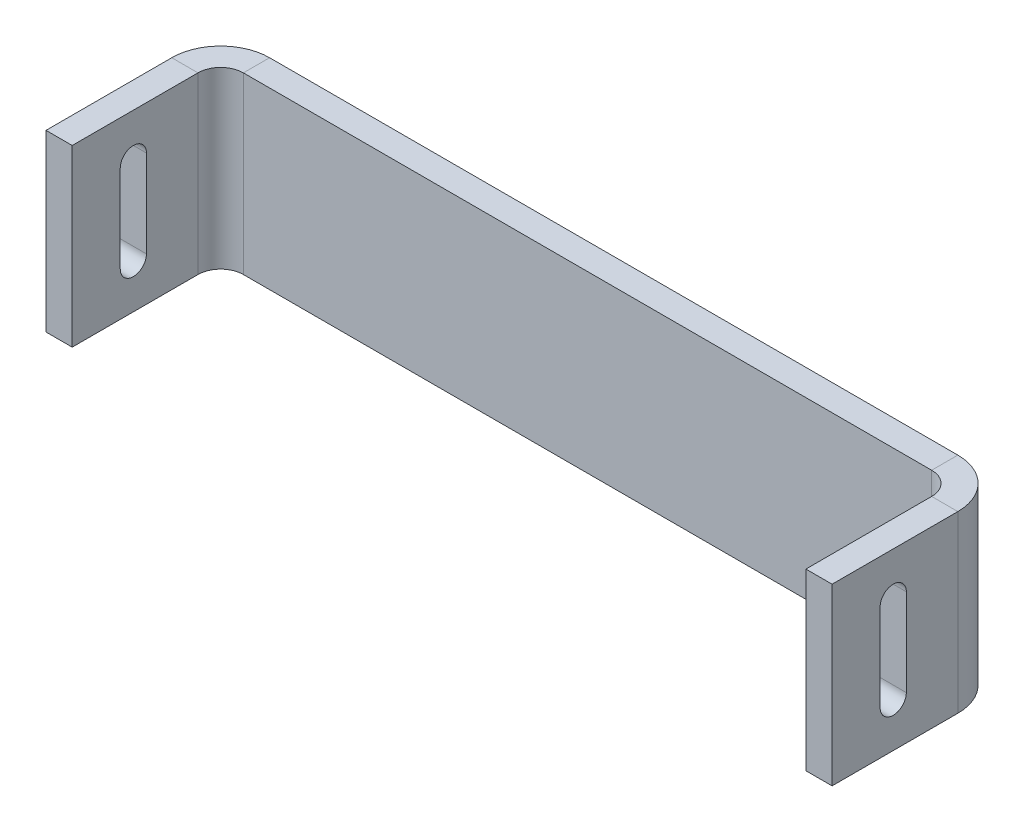
ISO-10303-21;
HEADER;
FILE_DESCRIPTION(('STEP AP214'),'2;1');
FILE_NAME('part.step','',(''),(''),'','','');
FILE_SCHEMA(('AUTOMOTIVE_DESIGN { 1 0 10303 214 1 1 1 1 }'));
ENDSEC;
DATA;
#1=APPLICATION_CONTEXT('core data for automotive mechanical design processes');
#2=APPLICATION_PROTOCOL_DEFINITION('international standard','automotive_design',2000,#1);
#3=PRODUCT_CONTEXT('',#1,'mechanical');
#4=PRODUCT('Part','Part','',(#3));
#5=PRODUCT_RELATED_PRODUCT_CATEGORY('part','',(#4));
#6=PRODUCT_DEFINITION_FORMATION('','',#4);
#7=PRODUCT_DEFINITION_CONTEXT('part definition',#1,'design');
#8=PRODUCT_DEFINITION('design','',#6,#7);
#9=PRODUCT_DEFINITION_SHAPE('','',#8);
#10=(LENGTH_UNIT() NAMED_UNIT(*) SI_UNIT(.MILLI.,.METRE.));
#11=(NAMED_UNIT(*) PLANE_ANGLE_UNIT() SI_UNIT($,.RADIAN.));
#12=(NAMED_UNIT(*) SI_UNIT($,.STERADIAN.) SOLID_ANGLE_UNIT());
#13=UNCERTAINTY_MEASURE_WITH_UNIT(LENGTH_MEASURE(1.E-05),#10,'distance_accuracy_value','');
#14=(GEOMETRIC_REPRESENTATION_CONTEXT(3) GLOBAL_UNCERTAINTY_ASSIGNED_CONTEXT((#13)) GLOBAL_UNIT_ASSIGNED_CONTEXT((#10,
#11,#12)) REPRESENTATION_CONTEXT('',''));
#15=CARTESIAN_POINT('',(0.,0.,0.));
#16=DIRECTION('',(0.,0.,1.));
#17=DIRECTION('',(1.,0.,0.));
#18=AXIS2_PLACEMENT_3D('',#15,#16,#17);
#19=CARTESIAN_POINT('',(0.,0.,-3.));
#20=DIRECTION('',(0.,0.,-1.));
#21=DIRECTION('',(-1.,0.,0.));
#22=AXIS2_PLACEMENT_3D('',#19,#20,#21);
#23=PLANE('',#22);
#24=DIRECTION('',(1.,0.,0.));
#25=VECTOR('',#24,1.);
#26=CARTESIAN_POINT('',(45.,-9.99999999999999,-3.));
#27=LINE('',#26,#25);
#28=CARTESIAN_POINT('',(-39.4,-10.,-3.));
#29=VERTEX_POINT('',#28);
#30=CARTESIAN_POINT('',(39.4,-9.99999999999999,-3.));
#31=VERTEX_POINT('',#30);
#32=EDGE_CURVE('E376',#29,#31,#27,.T.);
#33=ORIENTED_EDGE('',*,*,#32,.F.);
#34=DIRECTION('',(0.,-1.,0.));
#35=VECTOR('',#34,1.);
#36=CARTESIAN_POINT('',(-39.4,-10.,-3.));
#37=LINE('',#36,#35);
#38=CARTESIAN_POINT('',(-39.4,10.,-3.));
#39=VERTEX_POINT('',#38);
#40=EDGE_CURVE('E300',#29,#39,#37,.F.);
#41=ORIENTED_EDGE('',*,*,#40,.T.);
#42=DIRECTION('',(-1.,0.,0.));
#43=VECTOR('',#42,1.);
#44=CARTESIAN_POINT('',(45.,10.,-3.));
#45=LINE('',#44,#43);
#46=CARTESIAN_POINT('',(39.4,10.,-3.));
#47=VERTEX_POINT('',#46);
#48=EDGE_CURVE('E379',#47,#39,#45,.T.);
#49=ORIENTED_EDGE('',*,*,#48,.F.);
#50=DIRECTION('',(0.,1.,0.));
#51=VECTOR('',#50,1.);
#52=CARTESIAN_POINT('',(39.4,10.,-3.));
#53=LINE('',#52,#51);
#54=EDGE_CURVE('E353',#47,#31,#53,.F.);
#55=ORIENTED_EDGE('',*,*,#54,.T.);
#56=EDGE_LOOP('',(#33,#41,#49,#55));
#57=FACE_BOUND('',#56,.T.);
#58=ADVANCED_FACE('F85',(#57),#23,.T.);
#59=CARTESIAN_POINT('',(0.,0.,0.));
#60=DIRECTION('',(0.,0.,-1.));
#61=DIRECTION('',(-1.,0.,0.));
#62=AXIS2_PLACEMENT_3D('',#59,#60,#61);
#63=PLANE('',#62);
#64=DIRECTION('',(0.,-1.,0.));
#65=VECTOR('',#64,1.);
#66=CARTESIAN_POINT('',(-39.4,-10.,0.));
#67=LINE('',#66,#65);
#68=CARTESIAN_POINT('',(-39.4,-10.,0.));
#69=VERTEX_POINT('',#68);
#70=CARTESIAN_POINT('',(-39.4,9.99999999999999,0.));
#71=VERTEX_POINT('',#70);
#72=EDGE_CURVE('E313',#69,#71,#67,.F.);
#73=ORIENTED_EDGE('',*,*,#72,.F.);
#74=DIRECTION('',(1.,0.,0.));
#75=VECTOR('',#74,1.);
#76=CARTESIAN_POINT('',(45.,-9.99999999999999,0.));
#77=LINE('',#76,#75);
#78=CARTESIAN_POINT('',(39.4,-9.99999999999999,0.));
#79=VERTEX_POINT('',#78);
#80=EDGE_CURVE('E373',#69,#79,#77,.T.);
#81=ORIENTED_EDGE('',*,*,#80,.T.);
#82=DIRECTION('',(0.,1.,0.));
#83=VECTOR('',#82,1.);
#84=CARTESIAN_POINT('',(39.4,10.,0.));
#85=LINE('',#84,#83);
#86=CARTESIAN_POINT('',(39.4,10.,0.));
#87=VERTEX_POINT('',#86);
#88=EDGE_CURVE('E366',#87,#79,#85,.F.);
#89=ORIENTED_EDGE('',*,*,#88,.F.);
#90=DIRECTION('',(-1.,0.,0.));
#91=VECTOR('',#90,1.);
#92=CARTESIAN_POINT('',(45.,10.,0.));
#93=LINE('',#92,#91);
#94=EDGE_CURVE('E380',#87,#71,#93,.T.);
#95=ORIENTED_EDGE('',*,*,#94,.T.);
#96=EDGE_LOOP('',(#73,#81,#89,#95));
#97=FACE_BOUND('',#96,.T.);
#98=ADVANCED_FACE('F422',(#97),#63,.F.);
#99=CARTESIAN_POINT('',(45.,-9.99999999999999,-3.));
#100=DIRECTION('',(0.,-1.,0.));
#101=DIRECTION('',(1.,0.,0.));
#102=AXIS2_PLACEMENT_3D('',#99,#100,#101);
#103=PLANE('',#102);
#104=ORIENTED_EDGE('',*,*,#80,.F.);
#105=DIRECTION('',(0.,0.,-1.));
#106=VECTOR('',#105,1.);
#107=CARTESIAN_POINT('',(-39.4,-10.,0.));
#108=LINE('',#107,#106);
#109=EDGE_CURVE('E307',#69,#29,#108,.T.);
#110=ORIENTED_EDGE('',*,*,#109,.T.);
#111=ORIENTED_EDGE('',*,*,#32,.T.);
#112=DIRECTION('',(0.,0.,-1.));
#113=VECTOR('',#112,1.);
#114=CARTESIAN_POINT('',(39.4,-9.99999999999999,0.));
#115=LINE('',#114,#113);
#116=EDGE_CURVE('E370',#79,#31,#115,.T.);
#117=ORIENTED_EDGE('',*,*,#116,.F.);
#118=EDGE_LOOP('',(#104,#110,#111,#117));
#119=FACE_BOUND('',#118,.T.);
#120=ADVANCED_FACE('F87',(#119),#103,.T.);
#121=CARTESIAN_POINT('',(45.,10.,-3.));
#122=DIRECTION('',(0.,1.,0.));
#123=DIRECTION('',(-1.,0.,0.));
#124=AXIS2_PLACEMENT_3D('',#121,#122,#123);
#125=PLANE('',#124);
#126=DIRECTION('',(0.,0.,-1.));
#127=VECTOR('',#126,1.);
#128=CARTESIAN_POINT('',(-39.4,9.99999999999999,0.));
#129=LINE('',#128,#127);
#130=EDGE_CURVE('E317',#71,#39,#129,.T.);
#131=ORIENTED_EDGE('',*,*,#130,.F.);
#132=ORIENTED_EDGE('',*,*,#94,.F.);
#133=DIRECTION('',(0.,0.,-1.));
#134=VECTOR('',#133,1.);
#135=CARTESIAN_POINT('',(39.4,10.,0.));
#136=LINE('',#135,#134);
#137=EDGE_CURVE('E360',#87,#47,#136,.T.);
#138=ORIENTED_EDGE('',*,*,#137,.T.);
#139=ORIENTED_EDGE('',*,*,#48,.T.);
#140=EDGE_LOOP('',(#131,#132,#138,#139));
#141=FACE_BOUND('',#140,.T.);
#142=ADVANCED_FACE('F434',(#141),#125,.T.);
#143=CARTESIAN_POINT('',(39.4,-9.99999999999999,2.6));
#144=DIRECTION('',(0.,-1.,0.));
#145=DIRECTION('',(0.,0.,-1.));
#146=AXIS2_PLACEMENT_3D('',#143,#144,#145);
#147=PLANE('',#146);
#148=DIRECTION('',(-1.,0.,0.));
#149=VECTOR('',#148,1.);
#150=CARTESIAN_POINT('',(45.,-9.99999999999999,2.59999999999998));
#151=LINE('',#150,#149);
#152=CARTESIAN_POINT('',(42.,-9.99999999999999,2.59999999999999));
#153=VERTEX_POINT('',#152);
#154=CARTESIAN_POINT('',(45.,-9.99999999999999,2.59999999999998));
#155=VERTEX_POINT('',#154);
#156=EDGE_CURVE('E320',#153,#155,#151,.F.);
#157=ORIENTED_EDGE('',*,*,#156,.F.);
#158=CARTESIAN_POINT('',(39.4,-9.99999999999999,2.6));
#159=DIRECTION('',(0.,1.,0.));
#160=DIRECTION('',(0.,0.,1.));
#161=AXIS2_PLACEMENT_3D('',#158,#159,#160);
#162=CIRCLE('',#161,2.6);
#163=EDGE_CURVE('E363',#79,#153,#162,.F.);
#164=ORIENTED_EDGE('',*,*,#163,.F.);
#165=ORIENTED_EDGE('',*,*,#116,.T.);
#166=CARTESIAN_POINT('',(39.4,-9.99999999999999,2.6));
#167=DIRECTION('',(0.,1.,0.));
#168=DIRECTION('',(0.,0.,1.));
#169=AXIS2_PLACEMENT_3D('',#166,#167,#168);
#170=CIRCLE('',#169,5.6);
#171=EDGE_CURVE('E356',#31,#155,#170,.F.);
#172=ORIENTED_EDGE('',*,*,#171,.T.);
#173=EDGE_LOOP('',(#157,#164,#165,#172));
#174=FACE_BOUND('',#173,.T.);
#175=ADVANCED_FACE('F436',(#174),#147,.T.);
#176=CARTESIAN_POINT('',(39.4,10.,2.6));
#177=DIRECTION('',(0.,-1.,0.));
#178=DIRECTION('',(0.,0.,-1.));
#179=AXIS2_PLACEMENT_3D('',#176,#177,#178);
#180=PLANE('',#179);
#181=CARTESIAN_POINT('',(39.4,10.,2.6));
#182=DIRECTION('',(0.,1.,0.));
#183=DIRECTION('',(0.,0.,1.));
#184=AXIS2_PLACEMENT_3D('',#181,#182,#183);
#185=CIRCLE('',#184,2.6);
#186=CARTESIAN_POINT('',(42.,10.,2.59999999999999));
#187=VERTEX_POINT('',#186);
#188=EDGE_CURVE('E326',#187,#87,#185,.T.);
#189=ORIENTED_EDGE('',*,*,#188,.F.);
#190=DIRECTION('',(-1.,0.,0.));
#191=VECTOR('',#190,1.);
#192=CARTESIAN_POINT('',(42.,10.,2.59999999999999));
#193=LINE('',#192,#191);
#194=CARTESIAN_POINT('',(45.,10.,2.59999999999998));
#195=VERTEX_POINT('',#194);
#196=EDGE_CURVE('E346',#187,#195,#193,.F.);
#197=ORIENTED_EDGE('',*,*,#196,.T.);
#198=CARTESIAN_POINT('',(39.4,10.,2.6));
#199=DIRECTION('',(0.,1.,0.));
#200=DIRECTION('',(0.,0.,1.));
#201=AXIS2_PLACEMENT_3D('',#198,#199,#200);
#202=CIRCLE('',#201,5.6);
#203=EDGE_CURVE('E357',#195,#47,#202,.T.);
#204=ORIENTED_EDGE('',*,*,#203,.T.);
#205=ORIENTED_EDGE('',*,*,#137,.F.);
#206=EDGE_LOOP('',(#189,#197,#204,#205));
#207=FACE_BOUND('',#206,.T.);
#208=ADVANCED_FACE('F432',(#207),#180,.F.);
#209=CARTESIAN_POINT('',(39.4,10.,2.6));
#210=DIRECTION('',(0.,1.,0.));
#211=DIRECTION('',(1.,0.,0.));
#212=AXIS2_PLACEMENT_3D('',#209,#210,#211);
#213=CYLINDRICAL_SURFACE('',#212,5.6);
#214=ORIENTED_EDGE('',*,*,#54,.F.);
#215=ORIENTED_EDGE('',*,*,#203,.F.);
#216=DIRECTION('',(0.,1.,0.));
#217=VECTOR('',#216,1.);
#218=CARTESIAN_POINT('',(45.,-9.99999999999999,2.59999999999998));
#219=LINE('',#218,#217);
#220=EDGE_CURVE('E344',#195,#155,#219,.F.);
#221=ORIENTED_EDGE('',*,*,#220,.T.);
#222=ORIENTED_EDGE('',*,*,#171,.F.);
#223=EDGE_LOOP('',(#214,#215,#221,#222));
#224=FACE_BOUND('',#223,.T.);
#225=ADVANCED_FACE('F487',(#224),#213,.T.);
#226=CARTESIAN_POINT('',(39.4,10.,2.6));
#227=DIRECTION('',(0.,1.,0.));
#228=DIRECTION('',(1.,0.,0.));
#229=AXIS2_PLACEMENT_3D('',#226,#227,#228);
#230=CYLINDRICAL_SURFACE('',#229,2.6);
#231=ORIENTED_EDGE('',*,*,#88,.T.);
#232=ORIENTED_EDGE('',*,*,#163,.T.);
#233=DIRECTION('',(0.,1.,0.));
#234=VECTOR('',#233,1.);
#235=CARTESIAN_POINT('',(42.,-9.99999999999999,2.59999999999999));
#236=LINE('',#235,#234);
#237=EDGE_CURVE('E349',#153,#187,#236,.T.);
#238=ORIENTED_EDGE('',*,*,#237,.T.);
#239=ORIENTED_EDGE('',*,*,#188,.T.);
#240=EDGE_LOOP('',(#231,#232,#238,#239));
#241=FACE_BOUND('',#240,.T.);
#242=ADVANCED_FACE('F455',(#241),#230,.F.);
#243=CARTESIAN_POINT('',(45.,-9.99999999999999,0.));
#244=DIRECTION('',(0.,1.,0.));
#245=DIRECTION('',(0.,0.,1.));
#246=AXIS2_PLACEMENT_3D('',#243,#244,#245);
#247=PLANE('',#246);
#248=ORIENTED_EDGE('',*,*,#156,.T.);
#249=DIRECTION('',(0.,0.,-1.));
#250=VECTOR('',#249,1.);
#251=CARTESIAN_POINT('',(45.,-9.99999999999999,-1.75783387021378E-13));
#252=LINE('',#251,#250);
#253=CARTESIAN_POINT('',(45.0000000000001,-9.99999999999999,17.));
#254=VERTEX_POINT('',#253);
#255=EDGE_CURVE('E334',#254,#155,#252,.T.);
#256=ORIENTED_EDGE('',*,*,#255,.F.);
#257=DIRECTION('',(-1.,0.,0.));
#258=VECTOR('',#257,1.);
#259=CARTESIAN_POINT('',(45.0000000000001,-9.99999999999999,17.));
#260=LINE('',#259,#258);
#261=CARTESIAN_POINT('',(42.0000000000001,-9.99999999999999,17.));
#262=VERTEX_POINT('',#261);
#263=EDGE_CURVE('E327',#254,#262,#260,.T.);
#264=ORIENTED_EDGE('',*,*,#263,.T.);
#265=DIRECTION('',(0.,0.,1.));
#266=VECTOR('',#265,1.);
#267=CARTESIAN_POINT('',(42.,-9.99999999999999,0.));
#268=LINE('',#267,#266);
#269=EDGE_CURVE('E341',#262,#153,#268,.F.);
#270=ORIENTED_EDGE('',*,*,#269,.T.);
#271=EDGE_LOOP('',(#248,#256,#264,#270));
#272=FACE_BOUND('',#271,.T.);
#273=ADVANCED_FACE('F460',(#272),#247,.F.);
#274=CARTESIAN_POINT('',(45.0000000000001,10.,17.));
#275=DIRECTION('',(0.,-1.,0.));
#276=DIRECTION('',(0.,0.,-1.));
#277=AXIS2_PLACEMENT_3D('',#274,#275,#276);
#278=PLANE('',#277);
#279=ORIENTED_EDGE('',*,*,#196,.F.);
#280=DIRECTION('',(0.,0.,-1.));
#281=VECTOR('',#280,1.);
#282=CARTESIAN_POINT('',(42.0000000000001,10.,17.));
#283=LINE('',#282,#281);
#284=CARTESIAN_POINT('',(42.0000000000001,10.,17.));
#285=VERTEX_POINT('',#284);
#286=EDGE_CURVE('E339',#187,#285,#283,.F.);
#287=ORIENTED_EDGE('',*,*,#286,.T.);
#288=DIRECTION('',(-1.,0.,0.));
#289=VECTOR('',#288,1.);
#290=CARTESIAN_POINT('',(45.0000000000001,10.,17.));
#291=LINE('',#290,#289);
#292=CARTESIAN_POINT('',(45.0000000000001,10.,17.));
#293=VERTEX_POINT('',#292);
#294=EDGE_CURVE('E323',#293,#285,#291,.T.);
#295=ORIENTED_EDGE('',*,*,#294,.F.);
#296=DIRECTION('',(0.,0.,1.));
#297=VECTOR('',#296,1.);
#298=CARTESIAN_POINT('',(45.,10.,-1.75783387021378E-13));
#299=LINE('',#298,#297);
#300=EDGE_CURVE('E332',#195,#293,#299,.T.);
#301=ORIENTED_EDGE('',*,*,#300,.F.);
#302=EDGE_LOOP('',(#279,#287,#295,#301));
#303=FACE_BOUND('',#302,.T.);
#304=ADVANCED_FACE('F474',(#303),#278,.F.);
#305=CARTESIAN_POINT('',(45.,0.,-1.75783387021378E-13));
#306=DIRECTION('',(-1.,0.,0.));
#307=DIRECTION('',(0.,0.,1.));
#308=AXIS2_PLACEMENT_3D('',#305,#306,#307);
#309=PLANE('',#308);
#310=DIRECTION('',(0.,-1.,0.));
#311=VECTOR('',#310,1.);
#312=CARTESIAN_POINT('',(45.,5.,11.4999999999998));
#313=LINE('',#312,#311);
#314=CARTESIAN_POINT('',(45.,5.,11.4999999999998));
#315=VERTEX_POINT('',#314);
#316=CARTESIAN_POINT('',(45.,-5.,11.4999999999998));
#317=VERTEX_POINT('',#316);
#318=EDGE_CURVE('E233',#315,#317,#313,.T.);
#319=ORIENTED_EDGE('',*,*,#318,.F.);
#320=CARTESIAN_POINT('',(45.,5.,9.99999999999984));
#321=DIRECTION('',(1.,0.,0.));
#322=DIRECTION('',(0.,0.,-1.));
#323=AXIS2_PLACEMENT_3D('',#320,#321,#322);
#324=CIRCLE('',#323,1.5);
#325=CARTESIAN_POINT('',(45.,5.,8.49999999999984));
#326=VERTEX_POINT('',#325);
#327=EDGE_CURVE('E100',#326,#315,#324,.T.);
#328=ORIENTED_EDGE('',*,*,#327,.F.);
#329=DIRECTION('',(0.,1.,0.));
#330=VECTOR('',#329,1.);
#331=CARTESIAN_POINT('',(45.,5.,8.49999999999984));
#332=LINE('',#331,#330);
#333=CARTESIAN_POINT('',(45.,-5.,8.49999999999984));
#334=VERTEX_POINT('',#333);
#335=EDGE_CURVE('E240',#334,#326,#332,.T.);
#336=ORIENTED_EDGE('',*,*,#335,.F.);
#337=CARTESIAN_POINT('',(45.,-5.,9.99999999999984));
#338=DIRECTION('',(1.,0.,0.));
#339=DIRECTION('',(0.,0.,-1.));
#340=AXIS2_PLACEMENT_3D('',#337,#338,#339);
#341=CIRCLE('',#340,1.5);
#342=EDGE_CURVE('E224',#317,#334,#341,.T.);
#343=ORIENTED_EDGE('',*,*,#342,.F.);
#344=EDGE_LOOP('',(#319,#328,#336,#343));
#345=FACE_BOUND('',#344,.T.);
#346=ORIENTED_EDGE('',*,*,#220,.F.);
#347=ORIENTED_EDGE('',*,*,#300,.T.);
#348=DIRECTION('',(0.,-1.,0.));
#349=VECTOR('',#348,1.);
#350=CARTESIAN_POINT('',(45.0000000000001,0.,17.));
#351=LINE('',#350,#349);
#352=EDGE_CURVE('E330',#293,#254,#351,.T.);
#353=ORIENTED_EDGE('',*,*,#352,.T.);
#354=ORIENTED_EDGE('',*,*,#255,.T.);
#355=EDGE_LOOP('',(#346,#347,#353,#354));
#356=FACE_BOUND('',#355,.T.);
#357=ADVANCED_FACE('F237',(#345,#356),#309,.F.);
#358=CARTESIAN_POINT('',(42.,0.,-1.65308943004849E-13));
#359=DIRECTION('',(-1.,0.,0.));
#360=DIRECTION('',(0.,0.,1.));
#361=AXIS2_PLACEMENT_3D('',#358,#359,#360);
#362=PLANE('',#361);
#363=CARTESIAN_POINT('',(42.,5.,9.99999999999985));
#364=DIRECTION('',(-1.,0.,0.));
#365=DIRECTION('',(0.,0.,1.));
#366=AXIS2_PLACEMENT_3D('',#363,#364,#365);
#367=CIRCLE('',#366,1.5);
#368=CARTESIAN_POINT('',(42.,5.,11.4999999999998));
#369=VERTEX_POINT('',#368);
#370=CARTESIAN_POINT('',(42.,5.,8.49999999999985));
#371=VERTEX_POINT('',#370);
#372=EDGE_CURVE('E13',#369,#371,#367,.T.);
#373=ORIENTED_EDGE('',*,*,#372,.F.);
#374=DIRECTION('',(0.,1.,0.));
#375=VECTOR('',#374,1.);
#376=CARTESIAN_POINT('',(42.,0.,11.4999999999998));
#377=LINE('',#376,#375);
#378=CARTESIAN_POINT('',(42.,-5.,11.4999999999998));
#379=VERTEX_POINT('',#378);
#380=EDGE_CURVE('E396',#379,#369,#377,.T.);
#381=ORIENTED_EDGE('',*,*,#380,.F.);
#382=CARTESIAN_POINT('',(42.,-5.,9.99999999999985));
#383=DIRECTION('',(-1.,0.,0.));
#384=DIRECTION('',(0.,0.,1.));
#385=AXIS2_PLACEMENT_3D('',#382,#383,#384);
#386=CIRCLE('',#385,1.5);
#387=CARTESIAN_POINT('',(42.,-5.,8.49999999999985));
#388=VERTEX_POINT('',#387);
#389=EDGE_CURVE('E227',#388,#379,#386,.T.);
#390=ORIENTED_EDGE('',*,*,#389,.F.);
#391=DIRECTION('',(0.,-1.,0.));
#392=VECTOR('',#391,1.);
#393=CARTESIAN_POINT('',(42.,0.,8.49999999999985));
#394=LINE('',#393,#392);
#395=EDGE_CURVE('E93',#371,#388,#394,.T.);
#396=ORIENTED_EDGE('',*,*,#395,.F.);
#397=EDGE_LOOP('',(#373,#381,#390,#396));
#398=FACE_BOUND('',#397,.T.);
#399=ORIENTED_EDGE('',*,*,#286,.F.);
#400=ORIENTED_EDGE('',*,*,#237,.F.);
#401=ORIENTED_EDGE('',*,*,#269,.F.);
#402=DIRECTION('',(0.,1.,0.));
#403=VECTOR('',#402,1.);
#404=CARTESIAN_POINT('',(42.0000000000001,-9.99999999999999,17.));
#405=LINE('',#404,#403);
#406=EDGE_CURVE('E337',#285,#262,#405,.F.);
#407=ORIENTED_EDGE('',*,*,#406,.F.);
#408=EDGE_LOOP('',(#399,#400,#401,#407));
#409=FACE_BOUND('',#408,.T.);
#410=ADVANCED_FACE('F404',(#398,#409),#362,.T.);
#411=CARTESIAN_POINT('',(45.0000000000001,-9.99999999999999,17.));
#412=DIRECTION('',(0.,0.,-1.));
#413=DIRECTION('',(-1.,0.,0.));
#414=AXIS2_PLACEMENT_3D('',#411,#412,#413);
#415=PLANE('',#414);
#416=ORIENTED_EDGE('',*,*,#406,.T.);
#417=ORIENTED_EDGE('',*,*,#263,.F.);
#418=ORIENTED_EDGE('',*,*,#352,.F.);
#419=ORIENTED_EDGE('',*,*,#294,.T.);
#420=EDGE_LOOP('',(#416,#417,#418,#419));
#421=FACE_BOUND('',#420,.T.);
#422=ADVANCED_FACE('F468',(#421),#415,.F.);
#423=CARTESIAN_POINT('',(-39.4,9.99999999999999,2.6));
#424=DIRECTION('',(0.,1.,0.));
#425=DIRECTION('',(0.,0.,1.));
#426=AXIS2_PLACEMENT_3D('',#423,#424,#425);
#427=PLANE('',#426);
#428=DIRECTION('',(1.,0.,0.));
#429=VECTOR('',#428,1.);
#430=CARTESIAN_POINT('',(-45.,9.99999999999999,2.59999999999998));
#431=LINE('',#430,#429);
#432=CARTESIAN_POINT('',(-42.,9.99999999999999,2.59999999999999));
#433=VERTEX_POINT('',#432);
#434=CARTESIAN_POINT('',(-45.,9.99999999999999,2.59999999999998));
#435=VERTEX_POINT('',#434);
#436=EDGE_CURVE('E263',#433,#435,#431,.F.);
#437=ORIENTED_EDGE('',*,*,#436,.F.);
#438=CARTESIAN_POINT('',(-39.4,9.99999999999999,2.6));
#439=DIRECTION('',(0.,-1.,0.));
#440=DIRECTION('',(0.,0.,-1.));
#441=AXIS2_PLACEMENT_3D('',#438,#439,#440);
#442=CIRCLE('',#441,2.6);
#443=EDGE_CURVE('E310',#71,#433,#442,.F.);
#444=ORIENTED_EDGE('',*,*,#443,.F.);
#445=ORIENTED_EDGE('',*,*,#130,.T.);
#446=CARTESIAN_POINT('',(-39.4,9.99999999999999,2.6));
#447=DIRECTION('',(0.,-1.,0.));
#448=DIRECTION('',(0.,0.,-1.));
#449=AXIS2_PLACEMENT_3D('',#446,#447,#448);
#450=CIRCLE('',#449,5.6);
#451=EDGE_CURVE('E303',#39,#435,#450,.F.);
#452=ORIENTED_EDGE('',*,*,#451,.T.);
#453=EDGE_LOOP('',(#437,#444,#445,#452));
#454=FACE_BOUND('',#453,.T.);
#455=ADVANCED_FACE('F531',(#454),#427,.T.);
#456=CARTESIAN_POINT('',(-39.4,-10.,2.6));
#457=DIRECTION('',(0.,1.,0.));
#458=DIRECTION('',(0.,0.,1.));
#459=AXIS2_PLACEMENT_3D('',#456,#457,#458);
#460=PLANE('',#459);
#461=CARTESIAN_POINT('',(-39.4,-10.,2.6));
#462=DIRECTION('',(0.,-1.,0.));
#463=DIRECTION('',(0.,0.,-1.));
#464=AXIS2_PLACEMENT_3D('',#461,#462,#463);
#465=CIRCLE('',#464,2.6);
#466=CARTESIAN_POINT('',(-42.,-10.,2.59999999999999));
#467=VERTEX_POINT('',#466);
#468=EDGE_CURVE('E273',#467,#69,#465,.T.);
#469=ORIENTED_EDGE('',*,*,#468,.F.);
#470=DIRECTION('',(1.,0.,0.));
#471=VECTOR('',#470,1.);
#472=CARTESIAN_POINT('',(-42.,-10.,2.59999999999999));
#473=LINE('',#472,#471);
#474=CARTESIAN_POINT('',(-45.,-10.,2.59999999999998));
#475=VERTEX_POINT('',#474);
#476=EDGE_CURVE('E293',#467,#475,#473,.F.);
#477=ORIENTED_EDGE('',*,*,#476,.T.);
#478=CARTESIAN_POINT('',(-39.4,-10.,2.6));
#479=DIRECTION('',(0.,-1.,0.));
#480=DIRECTION('',(0.,0.,-1.));
#481=AXIS2_PLACEMENT_3D('',#478,#479,#480);
#482=CIRCLE('',#481,5.6);
#483=EDGE_CURVE('E304',#475,#29,#482,.T.);
#484=ORIENTED_EDGE('',*,*,#483,.T.);
#485=ORIENTED_EDGE('',*,*,#109,.F.);
#486=EDGE_LOOP('',(#469,#477,#484,#485));
#487=FACE_BOUND('',#486,.T.);
#488=ADVANCED_FACE('F540',(#487),#460,.F.);
#489=CARTESIAN_POINT('',(-39.4,-10.,2.6));
#490=DIRECTION('',(0.,-1.,0.));
#491=DIRECTION('',(-1.,0.,0.));
#492=AXIS2_PLACEMENT_3D('',#489,#490,#491);
#493=CYLINDRICAL_SURFACE('',#492,5.6);
#494=ORIENTED_EDGE('',*,*,#40,.F.);
#495=ORIENTED_EDGE('',*,*,#483,.F.);
#496=DIRECTION('',(0.,-1.,0.));
#497=VECTOR('',#496,1.);
#498=CARTESIAN_POINT('',(-45.,9.99999999999999,2.59999999999998));
#499=LINE('',#498,#497);
#500=EDGE_CURVE('E291',#475,#435,#499,.F.);
#501=ORIENTED_EDGE('',*,*,#500,.T.);
#502=ORIENTED_EDGE('',*,*,#451,.F.);
#503=EDGE_LOOP('',(#494,#495,#501,#502));
#504=FACE_BOUND('',#503,.T.);
#505=ADVANCED_FACE('F550',(#504),#493,.T.);
#506=CARTESIAN_POINT('',(-39.4,-10.,2.6));
#507=DIRECTION('',(0.,-1.,0.));
#508=DIRECTION('',(-1.,0.,0.));
#509=AXIS2_PLACEMENT_3D('',#506,#507,#508);
#510=CYLINDRICAL_SURFACE('',#509,2.6);
#511=ORIENTED_EDGE('',*,*,#72,.T.);
#512=ORIENTED_EDGE('',*,*,#443,.T.);
#513=DIRECTION('',(0.,-1.,0.));
#514=VECTOR('',#513,1.);
#515=CARTESIAN_POINT('',(-42.,9.99999999999999,2.59999999999999));
#516=LINE('',#515,#514);
#517=EDGE_CURVE('E296',#433,#467,#516,.T.);
#518=ORIENTED_EDGE('',*,*,#517,.T.);
#519=ORIENTED_EDGE('',*,*,#468,.T.);
#520=EDGE_LOOP('',(#511,#512,#518,#519));
#521=FACE_BOUND('',#520,.T.);
#522=ADVANCED_FACE('F561',(#521),#510,.F.);
#523=CARTESIAN_POINT('',(-45.,9.99999999999999,0.));
#524=DIRECTION('',(0.,-1.,0.));
#525=DIRECTION('',(0.,0.,-1.));
#526=AXIS2_PLACEMENT_3D('',#523,#524,#525);
#527=PLANE('',#526);
#528=ORIENTED_EDGE('',*,*,#436,.T.);
#529=DIRECTION('',(0.,0.,-1.));
#530=VECTOR('',#529,1.);
#531=CARTESIAN_POINT('',(-45.,9.99999999999999,-1.75783387021378E-13));
#532=LINE('',#531,#530);
#533=CARTESIAN_POINT('',(-45.0000000000001,9.99999999999999,17.));
#534=VERTEX_POINT('',#533);
#535=EDGE_CURVE('E281',#534,#435,#532,.T.);
#536=ORIENTED_EDGE('',*,*,#535,.F.);
#537=DIRECTION('',(1.,0.,0.));
#538=VECTOR('',#537,1.);
#539=CARTESIAN_POINT('',(-45.0000000000001,9.99999999999999,17.));
#540=LINE('',#539,#538);
#541=CARTESIAN_POINT('',(-42.0000000000001,9.99999999999999,17.));
#542=VERTEX_POINT('',#541);
#543=EDGE_CURVE('E274',#534,#542,#540,.T.);
#544=ORIENTED_EDGE('',*,*,#543,.T.);
#545=DIRECTION('',(0.,0.,1.));
#546=VECTOR('',#545,1.);
#547=CARTESIAN_POINT('',(-42.,9.99999999999999,0.));
#548=LINE('',#547,#546);
#549=EDGE_CURVE('E288',#542,#433,#548,.F.);
#550=ORIENTED_EDGE('',*,*,#549,.T.);
#551=EDGE_LOOP('',(#528,#536,#544,#550));
#552=FACE_BOUND('',#551,.T.);
#553=ADVANCED_FACE('F572',(#552),#527,.F.);
#554=CARTESIAN_POINT('',(-45.0000000000001,-10.,17.));
#555=DIRECTION('',(0.,1.,0.));
#556=DIRECTION('',(0.,0.,1.));
#557=AXIS2_PLACEMENT_3D('',#554,#555,#556);
#558=PLANE('',#557);
#559=ORIENTED_EDGE('',*,*,#476,.F.);
#560=DIRECTION('',(0.,0.,-1.));
#561=VECTOR('',#560,1.);
#562=CARTESIAN_POINT('',(-42.0000000000001,-10.,17.));
#563=LINE('',#562,#561);
#564=CARTESIAN_POINT('',(-42.0000000000001,-10.,17.));
#565=VERTEX_POINT('',#564);
#566=EDGE_CURVE('E286',#467,#565,#563,.F.);
#567=ORIENTED_EDGE('',*,*,#566,.T.);
#568=DIRECTION('',(1.,0.,0.));
#569=VECTOR('',#568,1.);
#570=CARTESIAN_POINT('',(-45.0000000000001,-10.,17.));
#571=LINE('',#570,#569);
#572=CARTESIAN_POINT('',(-45.0000000000001,-10.,17.));
#573=VERTEX_POINT('',#572);
#574=EDGE_CURVE('E270',#573,#565,#571,.T.);
#575=ORIENTED_EDGE('',*,*,#574,.F.);
#576=DIRECTION('',(0.,0.,1.));
#577=VECTOR('',#576,1.);
#578=CARTESIAN_POINT('',(-45.,-10.,-1.75783387021378E-13));
#579=LINE('',#578,#577);
#580=EDGE_CURVE('E279',#475,#573,#579,.T.);
#581=ORIENTED_EDGE('',*,*,#580,.F.);
#582=EDGE_LOOP('',(#559,#567,#575,#581));
#583=FACE_BOUND('',#582,.T.);
#584=ADVANCED_FACE('F583',(#583),#558,.F.);
#585=CARTESIAN_POINT('',(-45.,0.,-1.75783387021378E-13));
#586=DIRECTION('',(1.,0.,0.));
#587=DIRECTION('',(0.,0.,-1.));
#588=AXIS2_PLACEMENT_3D('',#585,#586,#587);
#589=PLANE('',#588);
#590=DIRECTION('',(0.,-1.,0.));
#591=VECTOR('',#590,1.);
#592=CARTESIAN_POINT('',(-45.,5.,8.49999999999984));
#593=LINE('',#592,#591);
#594=CARTESIAN_POINT('',(-45.,5.,8.49999999999984));
#595=VERTEX_POINT('',#594);
#596=CARTESIAN_POINT('',(-45.,-5.,8.49999999999984));
#597=VERTEX_POINT('',#596);
#598=EDGE_CURVE('E251',#595,#597,#593,.T.);
#599=ORIENTED_EDGE('',*,*,#598,.F.);
#600=CARTESIAN_POINT('',(-45.,5.,9.99999999999983));
#601=DIRECTION('',(-1.,0.,0.));
#602=DIRECTION('',(0.,0.,1.));
#603=AXIS2_PLACEMENT_3D('',#600,#601,#602);
#604=CIRCLE('',#603,1.5);
#605=CARTESIAN_POINT('',(-45.,5.,11.4999999999998));
#606=VERTEX_POINT('',#605);
#607=EDGE_CURVE('E247',#606,#595,#604,.T.);
#608=ORIENTED_EDGE('',*,*,#607,.F.);
#609=DIRECTION('',(0.,1.,0.));
#610=VECTOR('',#609,1.);
#611=CARTESIAN_POINT('',(-45.,5.,11.4999999999998));
#612=LINE('',#611,#610);
#613=CARTESIAN_POINT('',(-45.,-5.,11.4999999999998));
#614=VERTEX_POINT('',#613);
#615=EDGE_CURVE('E257',#614,#606,#612,.T.);
#616=ORIENTED_EDGE('',*,*,#615,.F.);
#617=CARTESIAN_POINT('',(-45.,-5.,9.99999999999983));
#618=DIRECTION('',(-1.,0.,0.));
#619=DIRECTION('',(0.,0.,1.));
#620=AXIS2_PLACEMENT_3D('',#617,#618,#619);
#621=CIRCLE('',#620,1.5);
#622=EDGE_CURVE('E254',#597,#614,#621,.T.);
#623=ORIENTED_EDGE('',*,*,#622,.F.);
#624=EDGE_LOOP('',(#599,#608,#616,#623));
#625=FACE_BOUND('',#624,.T.);
#626=ORIENTED_EDGE('',*,*,#500,.F.);
#627=ORIENTED_EDGE('',*,*,#580,.T.);
#628=DIRECTION('',(0.,1.,0.));
#629=VECTOR('',#628,1.);
#630=CARTESIAN_POINT('',(-45.0000000000001,0.,17.));
#631=LINE('',#630,#629);
#632=EDGE_CURVE('E277',#573,#534,#631,.T.);
#633=ORIENTED_EDGE('',*,*,#632,.T.);
#634=ORIENTED_EDGE('',*,*,#535,.T.);
#635=EDGE_LOOP('',(#626,#627,#633,#634));
#636=FACE_BOUND('',#635,.T.);
#637=ADVANCED_FACE('F594',(#625,#636),#589,.F.);
#638=CARTESIAN_POINT('',(-42.,0.,-1.65308943004849E-13));
#639=DIRECTION('',(1.,0.,0.));
#640=DIRECTION('',(0.,0.,-1.));
#641=AXIS2_PLACEMENT_3D('',#638,#639,#640);
#642=PLANE('',#641);
#643=CARTESIAN_POINT('',(-42.,5.,9.99999999999985));
#644=DIRECTION('',(1.,0.,0.));
#645=DIRECTION('',(0.,0.,-1.));
#646=AXIS2_PLACEMENT_3D('',#643,#644,#645);
#647=CIRCLE('',#646,1.5);
#648=CARTESIAN_POINT('',(-42.,5.,8.49999999999985));
#649=VERTEX_POINT('',#648);
#650=CARTESIAN_POINT('',(-42.,5.,11.4999999999998));
#651=VERTEX_POINT('',#650);
#652=EDGE_CURVE('E394',#649,#651,#647,.T.);
#653=ORIENTED_EDGE('',*,*,#652,.F.);
#654=DIRECTION('',(0.,1.,0.));
#655=VECTOR('',#654,1.);
#656=CARTESIAN_POINT('',(-42.,0.,8.49999999999985));
#657=LINE('',#656,#655);
#658=CARTESIAN_POINT('',(-42.,-5.,8.49999999999985));
#659=VERTEX_POINT('',#658);
#660=EDGE_CURVE('E383',#659,#649,#657,.T.);
#661=ORIENTED_EDGE('',*,*,#660,.F.);
#662=CARTESIAN_POINT('',(-42.,-5.,9.99999999999985));
#663=DIRECTION('',(1.,0.,0.));
#664=DIRECTION('',(0.,0.,-1.));
#665=AXIS2_PLACEMENT_3D('',#662,#663,#664);
#666=CIRCLE('',#665,1.5);
#667=CARTESIAN_POINT('',(-42.,-5.,11.4999999999998));
#668=VERTEX_POINT('',#667);
#669=EDGE_CURVE('E389',#668,#659,#666,.T.);
#670=ORIENTED_EDGE('',*,*,#669,.F.);
#671=DIRECTION('',(0.,-1.,0.));
#672=VECTOR('',#671,1.);
#673=CARTESIAN_POINT('',(-42.,0.,11.4999999999998));
#674=LINE('',#673,#672);
#675=EDGE_CURVE('E392',#651,#668,#674,.T.);
#676=ORIENTED_EDGE('',*,*,#675,.F.);
#677=EDGE_LOOP('',(#653,#661,#670,#676));
#678=FACE_BOUND('',#677,.T.);
#679=ORIENTED_EDGE('',*,*,#566,.F.);
#680=ORIENTED_EDGE('',*,*,#517,.F.);
#681=ORIENTED_EDGE('',*,*,#549,.F.);
#682=DIRECTION('',(0.,-1.,0.));
#683=VECTOR('',#682,1.);
#684=CARTESIAN_POINT('',(-42.0000000000001,9.99999999999999,17.));
#685=LINE('',#684,#683);
#686=EDGE_CURVE('E284',#565,#542,#685,.F.);
#687=ORIENTED_EDGE('',*,*,#686,.F.);
#688=EDGE_LOOP('',(#679,#680,#681,#687));
#689=FACE_BOUND('',#688,.T.);
#690=ADVANCED_FACE('F606',(#678,#689),#642,.T.);
#691=CARTESIAN_POINT('',(-45.0000000000001,9.99999999999999,17.));
#692=DIRECTION('',(0.,0.,-1.));
#693=DIRECTION('',(-1.,0.,0.));
#694=AXIS2_PLACEMENT_3D('',#691,#692,#693);
#695=PLANE('',#694);
#696=ORIENTED_EDGE('',*,*,#686,.T.);
#697=ORIENTED_EDGE('',*,*,#543,.F.);
#698=ORIENTED_EDGE('',*,*,#632,.F.);
#699=ORIENTED_EDGE('',*,*,#574,.T.);
#700=EDGE_LOOP('',(#696,#697,#698,#699));
#701=FACE_BOUND('',#700,.T.);
#702=ADVANCED_FACE('F617',(#701),#695,.F.);
#703=CARTESIAN_POINT('',(-35.,5.,9.99999999999987));
#704=DIRECTION('',(-1.,0.,0.));
#705=DIRECTION('',(0.,0.,1.));
#706=AXIS2_PLACEMENT_3D('',#703,#704,#705);
#707=CYLINDRICAL_SURFACE('',#706,1.5);
#708=ORIENTED_EDGE('',*,*,#652,.T.);
#709=DIRECTION('',(-1.,0.,0.));
#710=VECTOR('',#709,1.);
#711=CARTESIAN_POINT('',(-35.,5.,11.4999999999999));
#712=LINE('',#711,#710);
#713=EDGE_CURVE('E261',#651,#606,#712,.T.);
#714=ORIENTED_EDGE('',*,*,#713,.T.);
#715=ORIENTED_EDGE('',*,*,#607,.T.);
#716=DIRECTION('',(-1.,0.,0.));
#717=VECTOR('',#716,1.);
#718=CARTESIAN_POINT('',(-35.,5.,8.49999999999988));
#719=LINE('',#718,#717);
#720=EDGE_CURVE('E260',#649,#595,#719,.T.);
#721=ORIENTED_EDGE('',*,*,#720,.F.);
#722=EDGE_LOOP('',(#708,#714,#715,#721));
#723=FACE_BOUND('',#722,.T.);
#724=ADVANCED_FACE('F628',(#723),#707,.F.);
#725=CARTESIAN_POINT('',(-35.,5.,11.4999999999999));
#726=DIRECTION('',(0.,0.,1.));
#727=DIRECTION('',(1.,0.,0.));
#728=AXIS2_PLACEMENT_3D('',#725,#726,#727);
#729=PLANE('',#728);
#730=ORIENTED_EDGE('',*,*,#675,.T.);
#731=DIRECTION('',(-1.,0.,0.));
#732=VECTOR('',#731,1.);
#733=CARTESIAN_POINT('',(-35.,-5.,11.4999999999999));
#734=LINE('',#733,#732);
#735=EDGE_CURVE('E264',#668,#614,#734,.T.);
#736=ORIENTED_EDGE('',*,*,#735,.T.);
#737=ORIENTED_EDGE('',*,*,#615,.T.);
#738=ORIENTED_EDGE('',*,*,#713,.F.);
#739=EDGE_LOOP('',(#730,#736,#737,#738));
#740=FACE_BOUND('',#739,.T.);
#741=ADVANCED_FACE('F638',(#740),#729,.F.);
#742=CARTESIAN_POINT('',(-35.,-5.,9.99999999999987));
#743=DIRECTION('',(-1.,0.,0.));
#744=DIRECTION('',(0.,0.,1.));
#745=AXIS2_PLACEMENT_3D('',#742,#743,#744);
#746=CYLINDRICAL_SURFACE('',#745,1.5);
#747=ORIENTED_EDGE('',*,*,#669,.T.);
#748=DIRECTION('',(-1.,0.,0.));
#749=VECTOR('',#748,1.);
#750=CARTESIAN_POINT('',(-35.,-5.,8.49999999999987));
#751=LINE('',#750,#749);
#752=EDGE_CURVE('E266',#659,#597,#751,.T.);
#753=ORIENTED_EDGE('',*,*,#752,.T.);
#754=ORIENTED_EDGE('',*,*,#622,.T.);
#755=ORIENTED_EDGE('',*,*,#735,.F.);
#756=EDGE_LOOP('',(#747,#753,#754,#755));
#757=FACE_BOUND('',#756,.T.);
#758=ADVANCED_FACE('F416',(#757),#746,.F.);
#759=CARTESIAN_POINT('',(-35.,5.,8.49999999999988));
#760=DIRECTION('',(0.,0.,-1.));
#761=DIRECTION('',(-1.,0.,0.));
#762=AXIS2_PLACEMENT_3D('',#759,#760,#761);
#763=PLANE('',#762);
#764=ORIENTED_EDGE('',*,*,#660,.T.);
#765=ORIENTED_EDGE('',*,*,#720,.T.);
#766=ORIENTED_EDGE('',*,*,#598,.T.);
#767=ORIENTED_EDGE('',*,*,#752,.F.);
#768=EDGE_LOOP('',(#764,#765,#766,#767));
#769=FACE_BOUND('',#768,.T.);
#770=ADVANCED_FACE('F408',(#769),#763,.F.);
#771=CARTESIAN_POINT('',(35.,5.,9.99999999999987));
#772=DIRECTION('',(1.,0.,0.));
#773=DIRECTION('',(0.,0.,-1.));
#774=AXIS2_PLACEMENT_3D('',#771,#772,#773);
#775=CYLINDRICAL_SURFACE('',#774,1.5);
#776=ORIENTED_EDGE('',*,*,#372,.T.);
#777=DIRECTION('',(1.,0.,0.));
#778=VECTOR('',#777,1.);
#779=CARTESIAN_POINT('',(35.,5.,8.49999999999987));
#780=LINE('',#779,#778);
#781=EDGE_CURVE('E245',#371,#326,#780,.T.);
#782=ORIENTED_EDGE('',*,*,#781,.T.);
#783=ORIENTED_EDGE('',*,*,#327,.T.);
#784=DIRECTION('',(1.,0.,0.));
#785=VECTOR('',#784,1.);
#786=CARTESIAN_POINT('',(35.,5.,11.4999999999999));
#787=LINE('',#786,#785);
#788=EDGE_CURVE('E230',#369,#315,#787,.T.);
#789=ORIENTED_EDGE('',*,*,#788,.F.);
#790=EDGE_LOOP('',(#776,#782,#783,#789));
#791=FACE_BOUND('',#790,.T.);
#792=ADVANCED_FACE('F406',(#791),#775,.F.);
#793=CARTESIAN_POINT('',(35.,5.,8.49999999999987));
#794=DIRECTION('',(0.,0.,-1.));
#795=DIRECTION('',(-1.,0.,0.));
#796=AXIS2_PLACEMENT_3D('',#793,#794,#795);
#797=PLANE('',#796);
#798=ORIENTED_EDGE('',*,*,#395,.T.);
#799=DIRECTION('',(1.,0.,0.));
#800=VECTOR('',#799,1.);
#801=CARTESIAN_POINT('',(35.,-5.,8.49999999999987));
#802=LINE('',#801,#800);
#803=EDGE_CURVE('E229',#388,#334,#802,.T.);
#804=ORIENTED_EDGE('',*,*,#803,.T.);
#805=ORIENTED_EDGE('',*,*,#335,.T.);
#806=ORIENTED_EDGE('',*,*,#781,.F.);
#807=EDGE_LOOP('',(#798,#804,#805,#806));
#808=FACE_BOUND('',#807,.T.);
#809=ADVANCED_FACE('F401',(#808),#797,.F.);
#810=CARTESIAN_POINT('',(35.,-5.,9.99999999999987));
#811=DIRECTION('',(1.,0.,0.));
#812=DIRECTION('',(0.,0.,-1.));
#813=AXIS2_PLACEMENT_3D('',#810,#811,#812);
#814=CYLINDRICAL_SURFACE('',#813,1.5);
#815=ORIENTED_EDGE('',*,*,#389,.T.);
#816=DIRECTION('',(1.,0.,0.));
#817=VECTOR('',#816,1.);
#818=CARTESIAN_POINT('',(35.,-5.,11.4999999999999));
#819=LINE('',#818,#817);
#820=EDGE_CURVE('E108',#379,#317,#819,.T.);
#821=ORIENTED_EDGE('',*,*,#820,.T.);
#822=ORIENTED_EDGE('',*,*,#342,.T.);
#823=ORIENTED_EDGE('',*,*,#803,.F.);
#824=EDGE_LOOP('',(#815,#821,#822,#823));
#825=FACE_BOUND('',#824,.T.);
#826=ADVANCED_FACE('F221',(#825),#814,.F.);
#827=CARTESIAN_POINT('',(35.,5.,11.4999999999999));
#828=DIRECTION('',(0.,0.,1.));
#829=DIRECTION('',(1.,0.,0.));
#830=AXIS2_PLACEMENT_3D('',#827,#828,#829);
#831=PLANE('',#830);
#832=ORIENTED_EDGE('',*,*,#380,.T.);
#833=ORIENTED_EDGE('',*,*,#788,.T.);
#834=ORIENTED_EDGE('',*,*,#318,.T.);
#835=ORIENTED_EDGE('',*,*,#820,.F.);
#836=EDGE_LOOP('',(#832,#833,#834,#835));
#837=FACE_BOUND('',#836,.T.);
#838=ADVANCED_FACE('F234',(#837),#831,.F.);
#839=CLOSED_SHELL('',(#58,#98,#120,#142,#175,#208,#225,#242,#273,#304,#357,#410,#422,#455,#488,
#505,#522,#553,#584,#637,#690,#702,#724,#741,#758,#770,#792,#809,#826,#838));
#840=MANIFOLD_SOLID_BREP('B2',#839);
#841=ADVANCED_BREP_SHAPE_REPRESENTATION('',(#18,#840),#14);
#842=SHAPE_DEFINITION_REPRESENTATION(#9,#841);
ENDSEC;
END-ISO-10303-21;
